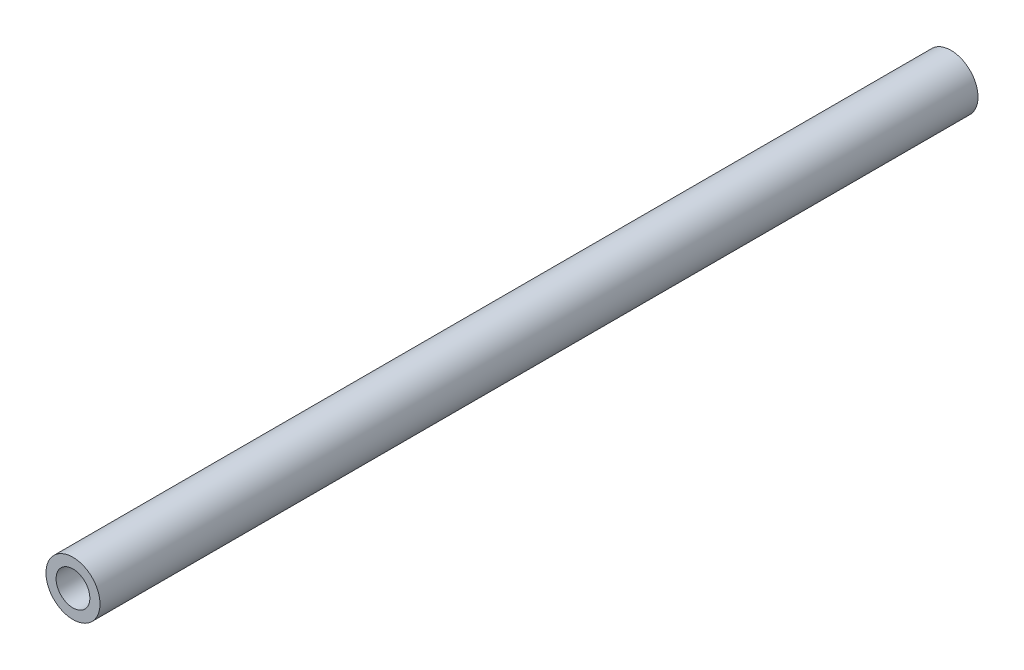
ISO-10303-21;
HEADER;
FILE_DESCRIPTION(('STEP AP214'),'2;1');
FILE_NAME('part.step','',(''),(''),'','','');
FILE_SCHEMA(('AUTOMOTIVE_DESIGN { 1 0 10303 214 1 1 1 1 }'));
ENDSEC;
DATA;
#1=APPLICATION_CONTEXT('core data for automotive mechanical design processes');
#2=APPLICATION_PROTOCOL_DEFINITION('international standard','automotive_design',2000,#1);
#3=PRODUCT_CONTEXT('',#1,'mechanical');
#4=PRODUCT('Part','Part','',(#3));
#5=PRODUCT_RELATED_PRODUCT_CATEGORY('part','',(#4));
#6=PRODUCT_DEFINITION_FORMATION('','',#4);
#7=PRODUCT_DEFINITION_CONTEXT('part definition',#1,'design');
#8=PRODUCT_DEFINITION('design','',#6,#7);
#9=PRODUCT_DEFINITION_SHAPE('','',#8);
#10=(LENGTH_UNIT() NAMED_UNIT(*) SI_UNIT(.MILLI.,.METRE.));
#11=(NAMED_UNIT(*) PLANE_ANGLE_UNIT() SI_UNIT($,.RADIAN.));
#12=(NAMED_UNIT(*) SI_UNIT($,.STERADIAN.) SOLID_ANGLE_UNIT());
#13=UNCERTAINTY_MEASURE_WITH_UNIT(LENGTH_MEASURE(1.E-05),#10,'distance_accuracy_value','');
#14=(GEOMETRIC_REPRESENTATION_CONTEXT(3) GLOBAL_UNCERTAINTY_ASSIGNED_CONTEXT((#13)) GLOBAL_UNIT_ASSIGNED_CONTEXT((#10,
#11,#12)) REPRESENTATION_CONTEXT('',''));
#15=CARTESIAN_POINT('',(0.,0.,0.));
#16=DIRECTION('',(0.,0.,1.));
#17=DIRECTION('',(1.,0.,0.));
#18=AXIS2_PLACEMENT_3D('',#15,#16,#17);
#19=CARTESIAN_POINT('',(0.,0.,125.));
#20=DIRECTION('',(0.,0.,1.));
#21=DIRECTION('',(1.,0.,0.));
#22=AXIS2_PLACEMENT_3D('',#19,#20,#21);
#23=PLANE('',#22);
#24=CARTESIAN_POINT('',(0.,0.,125.));
#25=DIRECTION('',(0.,0.,1.));
#26=DIRECTION('',(1.,0.,0.));
#27=AXIS2_PLACEMENT_3D('',#24,#25,#26);
#28=CIRCLE('',#27,4.);
#29=CARTESIAN_POINT('',(4.,0.,125.));
#30=VERTEX_POINT('',#29);
#31=EDGE_CURVE('E11',#30,#30,#28,.T.);
#32=ORIENTED_EDGE('',*,*,#31,.T.);
#33=EDGE_LOOP('',(#32));
#34=FACE_BOUND('',#33,.T.);
#35=CARTESIAN_POINT('',(0.,0.,125.));
#36=DIRECTION('',(0.,0.,1.));
#37=DIRECTION('',(1.,0.,0.));
#38=AXIS2_PLACEMENT_3D('',#35,#36,#37);
#39=CIRCLE('',#38,2.5);
#40=CARTESIAN_POINT('',(2.5,0.,125.));
#41=VERTEX_POINT('',#40);
#42=EDGE_CURVE('E50',#41,#41,#39,.T.);
#43=ORIENTED_EDGE('',*,*,#42,.F.);
#44=EDGE_LOOP('',(#43));
#45=FACE_BOUND('',#44,.T.);
#46=ADVANCED_FACE('F43',(#34,#45),#23,.T.);
#47=CARTESIAN_POINT('',(0.,0.,125.));
#48=DIRECTION('',(0.,0.,-1.));
#49=DIRECTION('',(-1.,0.,0.));
#50=AXIS2_PLACEMENT_3D('',#47,#48,#49);
#51=CYLINDRICAL_SURFACE('',#50,4.);
#52=ORIENTED_EDGE('',*,*,#31,.F.);
#53=EDGE_LOOP('',(#52));
#54=FACE_BOUND('',#53,.T.);
#55=CARTESIAN_POINT('',(0.,0.,-5.));
#56=DIRECTION('',(0.,0.,1.));
#57=DIRECTION('',(1.,0.,0.));
#58=AXIS2_PLACEMENT_3D('',#55,#56,#57);
#59=CIRCLE('',#58,4.);
#60=CARTESIAN_POINT('',(4.,0.,-5.));
#61=VERTEX_POINT('',#60);
#62=EDGE_CURVE('E59',#61,#61,#59,.T.);
#63=ORIENTED_EDGE('',*,*,#62,.T.);
#64=EDGE_LOOP('',(#63));
#65=FACE_BOUND('',#64,.T.);
#66=ADVANCED_FACE('F45',(#54,#65),#51,.T.);
#67=CARTESIAN_POINT('',(0.,0.,125.));
#68=DIRECTION('',(0.,0.,-1.));
#69=DIRECTION('',(-1.,0.,0.));
#70=AXIS2_PLACEMENT_3D('',#67,#68,#69);
#71=CYLINDRICAL_SURFACE('',#70,2.5);
#72=ORIENTED_EDGE('',*,*,#42,.T.);
#73=EDGE_LOOP('',(#72));
#74=FACE_BOUND('',#73,.T.);
#75=CARTESIAN_POINT('',(0.,0.,0.));
#76=DIRECTION('',(0.,0.,1.));
#77=DIRECTION('',(1.,0.,0.));
#78=AXIS2_PLACEMENT_3D('',#75,#76,#77);
#79=CIRCLE('',#78,2.5);
#80=CARTESIAN_POINT('',(2.5,0.,0.));
#81=VERTEX_POINT('',#80);
#82=EDGE_CURVE('E54',#81,#81,#79,.T.);
#83=ORIENTED_EDGE('',*,*,#82,.F.);
#84=EDGE_LOOP('',(#83));
#85=FACE_BOUND('',#84,.T.);
#86=ADVANCED_FACE('F72',(#74,#85),#71,.F.);
#87=CARTESIAN_POINT('',(0.,0.,0.));
#88=DIRECTION('',(0.,0.,1.));
#89=DIRECTION('',(1.,0.,0.));
#90=AXIS2_PLACEMENT_3D('',#87,#88,#89);
#91=PLANE('',#90);
#92=ORIENTED_EDGE('',*,*,#82,.T.);
#93=EDGE_LOOP('',(#92));
#94=FACE_BOUND('',#93,.T.);
#95=ADVANCED_FACE('F67',(#94),#91,.T.);
#96=CARTESIAN_POINT('',(0.,0.,-5.));
#97=DIRECTION('',(0.,0.,1.));
#98=DIRECTION('',(1.,0.,0.));
#99=AXIS2_PLACEMENT_3D('',#96,#97,#98);
#100=PLANE('',#99);
#101=ORIENTED_EDGE('',*,*,#62,.F.);
#102=EDGE_LOOP('',(#101));
#103=FACE_BOUND('',#102,.T.);
#104=ADVANCED_FACE('F65',(#103),#100,.F.);
#105=CLOSED_SHELL('',(#46,#66,#86,#95,#104));
#106=MANIFOLD_SOLID_BREP('B2',#105);
#107=ADVANCED_BREP_SHAPE_REPRESENTATION('',(#18,#106),#14);
#108=SHAPE_DEFINITION_REPRESENTATION(#9,#107);
ENDSEC;
END-ISO-10303-21;
